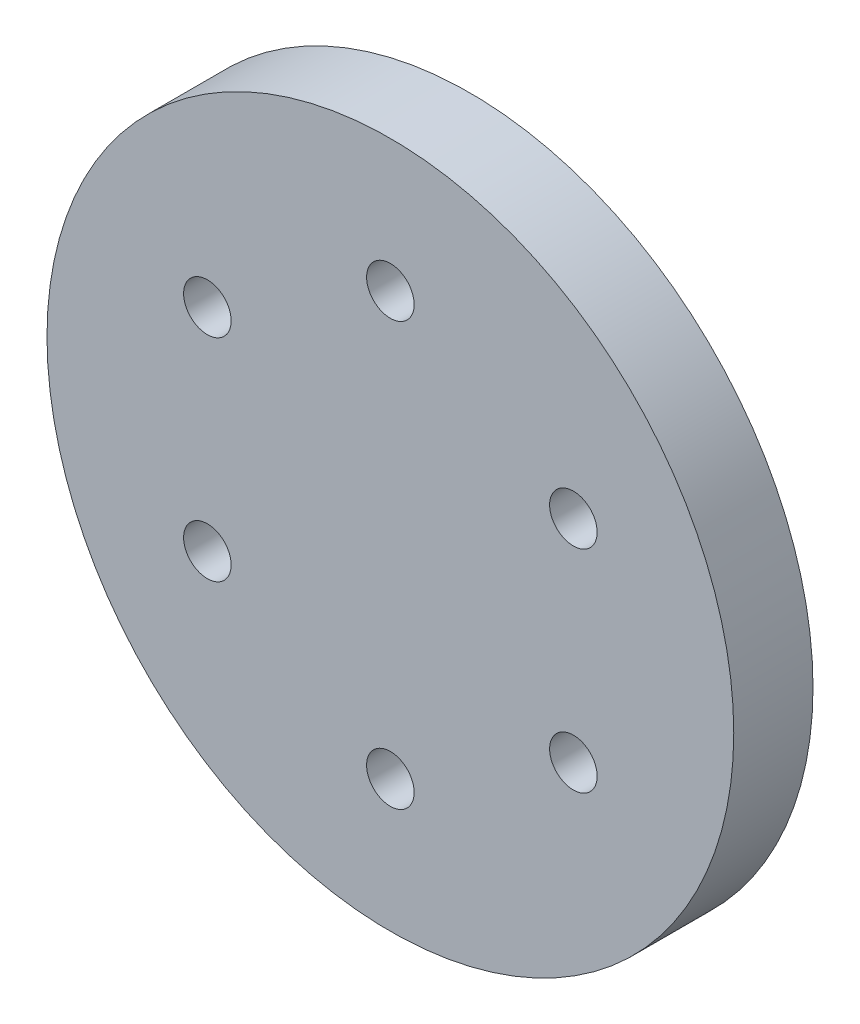
ISO-10303-21;
HEADER;
FILE_DESCRIPTION(('STEP AP214'),'2;1');
FILE_NAME('part.step','',(''),(''),'','','');
FILE_SCHEMA(('AUTOMOTIVE_DESIGN { 1 0 10303 214 1 1 1 1 }'));
ENDSEC;
DATA;
#1=APPLICATION_CONTEXT('core data for automotive mechanical design processes');
#2=APPLICATION_PROTOCOL_DEFINITION('international standard','automotive_design',2000,#1);
#3=PRODUCT_CONTEXT('',#1,'mechanical');
#4=PRODUCT('Part','Part','',(#3));
#5=PRODUCT_RELATED_PRODUCT_CATEGORY('part','',(#4));
#6=PRODUCT_DEFINITION_FORMATION('','',#4);
#7=PRODUCT_DEFINITION_CONTEXT('part definition',#1,'design');
#8=PRODUCT_DEFINITION('design','',#6,#7);
#9=PRODUCT_DEFINITION_SHAPE('','',#8);
#10=(LENGTH_UNIT() NAMED_UNIT(*) SI_UNIT(.MILLI.,.METRE.));
#11=(NAMED_UNIT(*) PLANE_ANGLE_UNIT() SI_UNIT($,.RADIAN.));
#12=(NAMED_UNIT(*) SI_UNIT($,.STERADIAN.) SOLID_ANGLE_UNIT());
#13=UNCERTAINTY_MEASURE_WITH_UNIT(LENGTH_MEASURE(1.E-05),#10,'distance_accuracy_value','');
#14=(GEOMETRIC_REPRESENTATION_CONTEXT(3) GLOBAL_UNCERTAINTY_ASSIGNED_CONTEXT((#13)) GLOBAL_UNIT_ASSIGNED_CONTEXT((#10,
#11,#12)) REPRESENTATION_CONTEXT('',''));
#15=CARTESIAN_POINT('',(0.,0.,0.));
#16=DIRECTION('',(0.,0.,1.));
#17=DIRECTION('',(1.,0.,0.));
#18=AXIS2_PLACEMENT_3D('',#15,#16,#17);
#19=CARTESIAN_POINT('',(-6.92820323027552,3.99999999999998,3.));
#20=DIRECTION('',(0.,0.,-1.));
#21=DIRECTION('',(-1.,0.,0.));
#22=AXIS2_PLACEMENT_3D('',#19,#20,#21);
#23=CYLINDRICAL_SURFACE('',#22,0.9);
#24=CARTESIAN_POINT('',(-6.92820323027552,3.99999999999998,3.));
#25=DIRECTION('',(0.,0.,-1.));
#26=DIRECTION('',(-0.499999999999998,-0.86602540378444,0.));
#27=AXIS2_PLACEMENT_3D('',#24,#25,#26);
#28=CIRCLE('',#27,0.9);
#29=CARTESIAN_POINT('',(-7.37820323027552,3.22057713659399,3.));
#30=VERTEX_POINT('',#29);
#31=EDGE_CURVE('E86',#30,#30,#28,.T.);
#32=ORIENTED_EDGE('',*,*,#31,.F.);
#33=EDGE_LOOP('',(#32));
#34=FACE_BOUND('',#33,.T.);
#35=CARTESIAN_POINT('',(-6.92820323027552,3.99999999999998,1.5));
#36=DIRECTION('',(0.,0.,-1.));
#37=DIRECTION('',(-1.,0.,0.));
#38=AXIS2_PLACEMENT_3D('',#35,#36,#37);
#39=CIRCLE('',#38,0.9);
#40=CARTESIAN_POINT('',(-7.82820323027552,3.99999999999998,1.5));
#41=VERTEX_POINT('',#40);
#42=EDGE_CURVE('E41',#41,#41,#39,.F.);
#43=ORIENTED_EDGE('',*,*,#42,.F.);
#44=EDGE_LOOP('',(#43));
#45=FACE_BOUND('',#44,.T.);
#46=ADVANCED_FACE('F37',(#34,#45),#23,.F.);
#47=CARTESIAN_POINT('',(-6.92820323027549,-4.00000000000003,3.));
#48=DIRECTION('',(0.,0.,-1.));
#49=DIRECTION('',(-1.,0.,0.));
#50=AXIS2_PLACEMENT_3D('',#47,#48,#49);
#51=CYLINDRICAL_SURFACE('',#50,0.9);
#52=CARTESIAN_POINT('',(-6.92820323027549,-4.00000000000003,3.));
#53=DIRECTION('',(0.,0.,-1.));
#54=DIRECTION('',(0.500000000000004,-0.866025403784436,0.));
#55=AXIS2_PLACEMENT_3D('',#52,#53,#54);
#56=CIRCLE('',#55,0.9);
#57=CARTESIAN_POINT('',(-6.47820323027549,-4.77942286340603,3.));
#58=VERTEX_POINT('',#57);
#59=EDGE_CURVE('E90',#58,#58,#56,.T.);
#60=ORIENTED_EDGE('',*,*,#59,.F.);
#61=EDGE_LOOP('',(#60));
#62=FACE_BOUND('',#61,.T.);
#63=CARTESIAN_POINT('',(-6.92820323027549,-4.00000000000003,1.5));
#64=DIRECTION('',(0.,0.,-1.));
#65=DIRECTION('',(-1.,0.,0.));
#66=AXIS2_PLACEMENT_3D('',#63,#64,#65);
#67=CIRCLE('',#66,0.9);
#68=CARTESIAN_POINT('',(-7.82820323027549,-4.00000000000003,1.5));
#69=VERTEX_POINT('',#68);
#70=EDGE_CURVE('E68',#69,#69,#67,.F.);
#71=ORIENTED_EDGE('',*,*,#70,.F.);
#72=EDGE_LOOP('',(#71));
#73=FACE_BOUND('',#72,.T.);
#74=ADVANCED_FACE('F117',(#62,#73),#51,.F.);
#75=CARTESIAN_POINT('',(0.,-8.,3.));
#76=DIRECTION('',(0.,0.,-1.));
#77=DIRECTION('',(-1.,0.,0.));
#78=AXIS2_PLACEMENT_3D('',#75,#76,#77);
#79=CYLINDRICAL_SURFACE('',#78,0.9);
#80=CARTESIAN_POINT('',(0.,-8.,3.));
#81=DIRECTION('',(0.,0.,-1.));
#82=DIRECTION('',(1.,0.,0.));
#83=AXIS2_PLACEMENT_3D('',#80,#81,#82);
#84=CIRCLE('',#83,0.9);
#85=CARTESIAN_POINT('',(0.9,-8.,3.));
#86=VERTEX_POINT('',#85);
#87=EDGE_CURVE('E82',#86,#86,#84,.T.);
#88=ORIENTED_EDGE('',*,*,#87,.F.);
#89=EDGE_LOOP('',(#88));
#90=FACE_BOUND('',#89,.T.);
#91=CARTESIAN_POINT('',(0.,-8.,1.5));
#92=DIRECTION('',(0.,0.,-1.));
#93=DIRECTION('',(-1.,0.,0.));
#94=AXIS2_PLACEMENT_3D('',#91,#92,#93);
#95=CIRCLE('',#94,0.9);
#96=CARTESIAN_POINT('',(-0.9,-8.,1.5));
#97=VERTEX_POINT('',#96);
#98=EDGE_CURVE('E66',#97,#97,#95,.F.);
#99=ORIENTED_EDGE('',*,*,#98,.F.);
#100=EDGE_LOOP('',(#99));
#101=FACE_BOUND('',#100,.T.);
#102=ADVANCED_FACE('F123',(#90,#101),#79,.F.);
#103=CARTESIAN_POINT('',(6.92820323027555,-3.99999999999994,3.));
#104=DIRECTION('',(0.,0.,-1.));
#105=DIRECTION('',(-1.,0.,0.));
#106=AXIS2_PLACEMENT_3D('',#103,#104,#105);
#107=CYLINDRICAL_SURFACE('',#106,0.9);
#108=CARTESIAN_POINT('',(6.92820323027555,-3.99999999999994,3.));
#109=DIRECTION('',(0.,0.,-1.));
#110=DIRECTION('',(0.499999999999992,0.866025403784443,0.));
#111=AXIS2_PLACEMENT_3D('',#108,#109,#110);
#112=CIRCLE('',#111,0.9);
#113=CARTESIAN_POINT('',(7.37820323027554,-3.22057713659394,3.));
#114=VERTEX_POINT('',#113);
#115=EDGE_CURVE('E77',#114,#114,#112,.T.);
#116=ORIENTED_EDGE('',*,*,#115,.F.);
#117=EDGE_LOOP('',(#116));
#118=FACE_BOUND('',#117,.T.);
#119=CARTESIAN_POINT('',(6.92820323027555,-3.99999999999994,1.5));
#120=DIRECTION('',(0.,0.,-1.));
#121=DIRECTION('',(-1.,0.,0.));
#122=AXIS2_PLACEMENT_3D('',#119,#120,#121);
#123=CIRCLE('',#122,0.9);
#124=CARTESIAN_POINT('',(6.02820323027555,-3.99999999999994,1.5));
#125=VERTEX_POINT('',#124);
#126=EDGE_CURVE('E62',#125,#125,#123,.F.);
#127=ORIENTED_EDGE('',*,*,#126,.F.);
#128=EDGE_LOOP('',(#127));
#129=FACE_BOUND('',#128,.T.);
#130=ADVANCED_FACE('F169',(#118,#129),#107,.F.);
#131=CARTESIAN_POINT('',(6.92820323027546,4.00000000000008,3.));
#132=DIRECTION('',(0.,0.,-1.));
#133=DIRECTION('',(-1.,0.,0.));
#134=AXIS2_PLACEMENT_3D('',#131,#132,#133);
#135=CYLINDRICAL_SURFACE('',#134,0.9);
#136=CARTESIAN_POINT('',(6.92820323027546,4.00000000000008,3.));
#137=DIRECTION('',(0.,0.,-1.));
#138=DIRECTION('',(-0.50000000000001,0.866025403784433,0.));
#139=AXIS2_PLACEMENT_3D('',#136,#137,#138);
#140=CIRCLE('',#139,0.9);
#141=CARTESIAN_POINT('',(6.47820323027545,4.77942286340607,3.));
#142=VERTEX_POINT('',#141);
#143=EDGE_CURVE('E73',#142,#142,#140,.T.);
#144=ORIENTED_EDGE('',*,*,#143,.F.);
#145=EDGE_LOOP('',(#144));
#146=FACE_BOUND('',#145,.T.);
#147=CARTESIAN_POINT('',(6.92820323027546,4.00000000000008,1.5));
#148=DIRECTION('',(0.,0.,-1.));
#149=DIRECTION('',(-1.,0.,0.));
#150=AXIS2_PLACEMENT_3D('',#147,#148,#149);
#151=CIRCLE('',#150,0.9);
#152=CARTESIAN_POINT('',(6.02820323027546,4.00000000000008,1.5));
#153=VERTEX_POINT('',#152);
#154=EDGE_CURVE('E59',#153,#153,#151,.F.);
#155=ORIENTED_EDGE('',*,*,#154,.F.);
#156=EDGE_LOOP('',(#155));
#157=FACE_BOUND('',#156,.T.);
#158=ADVANCED_FACE('F113',(#146,#157),#135,.F.);
#159=CARTESIAN_POINT('',(0.,8.,3.));
#160=DIRECTION('',(0.,0.,-1.));
#161=DIRECTION('',(-1.,0.,0.));
#162=AXIS2_PLACEMENT_3D('',#159,#160,#161);
#163=CYLINDRICAL_SURFACE('',#162,0.9);
#164=CARTESIAN_POINT('',(0.,8.,3.));
#165=DIRECTION('',(0.,0.,-1.));
#166=DIRECTION('',(-1.,0.,0.));
#167=AXIS2_PLACEMENT_3D('',#164,#165,#166);
#168=CIRCLE('',#167,0.9);
#169=CARTESIAN_POINT('',(-0.9,8.,3.));
#170=VERTEX_POINT('',#169);
#171=EDGE_CURVE('E50',#170,#170,#168,.T.);
#172=ORIENTED_EDGE('',*,*,#171,.F.);
#173=EDGE_LOOP('',(#172));
#174=FACE_BOUND('',#173,.T.);
#175=CARTESIAN_POINT('',(0.,8.,1.5));
#176=DIRECTION('',(0.,0.,-1.));
#177=DIRECTION('',(-1.,0.,0.));
#178=AXIS2_PLACEMENT_3D('',#175,#176,#177);
#179=CIRCLE('',#178,0.9);
#180=CARTESIAN_POINT('',(-0.9,8.,1.5));
#181=VERTEX_POINT('',#180);
#182=EDGE_CURVE('E55',#181,#181,#179,.F.);
#183=ORIENTED_EDGE('',*,*,#182,.F.);
#184=EDGE_LOOP('',(#183));
#185=FACE_BOUND('',#184,.T.);
#186=ADVANCED_FACE('F106',(#174,#185),#163,.F.);
#187=CARTESIAN_POINT('',(0.,0.,3.));
#188=DIRECTION('',(0.,0.,-1.));
#189=DIRECTION('',(-1.,0.,0.));
#190=AXIS2_PLACEMENT_3D('',#187,#188,#189);
#191=CYLINDRICAL_SURFACE('',#190,13.);
#192=CARTESIAN_POINT('',(0.,0.,3.));
#193=DIRECTION('',(0.,0.,1.));
#194=DIRECTION('',(1.,0.,0.));
#195=AXIS2_PLACEMENT_3D('',#192,#193,#194);
#196=CIRCLE('',#195,13.);
#197=CARTESIAN_POINT('',(13.,0.,3.));
#198=VERTEX_POINT('',#197);
#199=EDGE_CURVE('E10',#198,#198,#196,.T.);
#200=ORIENTED_EDGE('',*,*,#199,.F.);
#201=EDGE_LOOP('',(#200));
#202=FACE_BOUND('',#201,.T.);
#203=CARTESIAN_POINT('',(0.,0.,0.));
#204=DIRECTION('',(0.,0.,1.));
#205=DIRECTION('',(1.,0.,0.));
#206=AXIS2_PLACEMENT_3D('',#203,#204,#205);
#207=CIRCLE('',#206,13.);
#208=CARTESIAN_POINT('',(13.,0.,0.));
#209=VERTEX_POINT('',#208);
#210=EDGE_CURVE('E45',#209,#209,#207,.T.);
#211=ORIENTED_EDGE('',*,*,#210,.T.);
#212=EDGE_LOOP('',(#211));
#213=FACE_BOUND('',#212,.T.);
#214=ADVANCED_FACE('F39',(#202,#213),#191,.T.);
#215=CARTESIAN_POINT('',(0.,0.,3.));
#216=DIRECTION('',(0.,0.,1.));
#217=DIRECTION('',(1.,0.,0.));
#218=AXIS2_PLACEMENT_3D('',#215,#216,#217);
#219=PLANE('',#218);
#220=ORIENTED_EDGE('',*,*,#143,.T.);
#221=EDGE_LOOP('',(#220));
#222=FACE_BOUND('',#221,.T.);
#223=ORIENTED_EDGE('',*,*,#115,.T.);
#224=EDGE_LOOP('',(#223));
#225=FACE_BOUND('',#224,.T.);
#226=ORIENTED_EDGE('',*,*,#87,.T.);
#227=EDGE_LOOP('',(#226));
#228=FACE_BOUND('',#227,.T.);
#229=ORIENTED_EDGE('',*,*,#59,.T.);
#230=EDGE_LOOP('',(#229));
#231=FACE_BOUND('',#230,.T.);
#232=ORIENTED_EDGE('',*,*,#31,.T.);
#233=EDGE_LOOP('',(#232));
#234=FACE_BOUND('',#233,.T.);
#235=ORIENTED_EDGE('',*,*,#171,.T.);
#236=EDGE_LOOP('',(#235));
#237=FACE_BOUND('',#236,.T.);
#238=ORIENTED_EDGE('',*,*,#199,.T.);
#239=EDGE_LOOP('',(#238));
#240=FACE_BOUND('',#239,.T.);
#241=ADVANCED_FACE('F101',(#222,#225,#228,#231,#234,#237,#240),#219,.T.);
#242=CARTESIAN_POINT('',(0.,0.,0.));
#243=DIRECTION('',(0.,0.,1.));
#244=DIRECTION('',(1.,0.,0.));
#245=AXIS2_PLACEMENT_3D('',#242,#243,#244);
#246=PLANE('',#245);
#247=CARTESIAN_POINT('',(6.92820323027546,4.00000000000008,0.));
#248=DIRECTION('',(0.,0.,-1.));
#249=DIRECTION('',(-0.50000000000001,0.866025403784433,0.));
#250=AXIS2_PLACEMENT_3D('',#247,#248,#249);
#251=CIRCLE('',#250,1.5);
#252=CARTESIAN_POINT('',(6.17820323027545,5.29903810567673,0.));
#253=VERTEX_POINT('',#252);
#254=EDGE_CURVE('E229',#253,#253,#251,.T.);
#255=ORIENTED_EDGE('',*,*,#254,.F.);
#256=EDGE_LOOP('',(#255));
#257=FACE_BOUND('',#256,.T.);
#258=CARTESIAN_POINT('',(6.92820323027555,-3.99999999999994,0.));
#259=DIRECTION('',(0.,0.,-1.));
#260=DIRECTION('',(0.499999999999992,0.866025403784443,0.));
#261=AXIS2_PLACEMENT_3D('',#258,#259,#260);
#262=CIRCLE('',#261,1.5);
#263=CARTESIAN_POINT('',(7.67820323027553,-2.70096189432327,0.));
#264=VERTEX_POINT('',#263);
#265=EDGE_CURVE('E224',#264,#264,#262,.T.);
#266=ORIENTED_EDGE('',*,*,#265,.F.);
#267=EDGE_LOOP('',(#266));
#268=FACE_BOUND('',#267,.T.);
#269=CARTESIAN_POINT('',(0.,-8.,0.));
#270=DIRECTION('',(0.,0.,-1.));
#271=DIRECTION('',(1.,0.,0.));
#272=AXIS2_PLACEMENT_3D('',#269,#270,#271);
#273=CIRCLE('',#272,1.5);
#274=CARTESIAN_POINT('',(1.5,-8.,0.));
#275=VERTEX_POINT('',#274);
#276=EDGE_CURVE('E219',#275,#275,#273,.T.);
#277=ORIENTED_EDGE('',*,*,#276,.F.);
#278=EDGE_LOOP('',(#277));
#279=FACE_BOUND('',#278,.T.);
#280=CARTESIAN_POINT('',(-6.92820323027549,-4.00000000000003,0.));
#281=DIRECTION('',(0.,0.,-1.));
#282=DIRECTION('',(0.500000000000004,-0.866025403784436,0.));
#283=AXIS2_PLACEMENT_3D('',#280,#281,#282);
#284=CIRCLE('',#283,1.5);
#285=CARTESIAN_POINT('',(-6.17820323027549,-5.29903810567669,0.));
#286=VERTEX_POINT('',#285);
#287=EDGE_CURVE('E209',#286,#286,#284,.T.);
#288=ORIENTED_EDGE('',*,*,#287,.F.);
#289=EDGE_LOOP('',(#288));
#290=FACE_BOUND('',#289,.T.);
#291=CARTESIAN_POINT('',(-6.92820323027552,3.99999999999998,0.));
#292=DIRECTION('',(0.,0.,-1.));
#293=DIRECTION('',(-0.499999999999998,-0.86602540378444,0.));
#294=AXIS2_PLACEMENT_3D('',#291,#292,#293);
#295=CIRCLE('',#294,1.5);
#296=CARTESIAN_POINT('',(-7.67820323027552,2.70096189432332,0.));
#297=VERTEX_POINT('',#296);
#298=EDGE_CURVE('E208',#297,#297,#295,.T.);
#299=ORIENTED_EDGE('',*,*,#298,.F.);
#300=EDGE_LOOP('',(#299));
#301=FACE_BOUND('',#300,.T.);
#302=CARTESIAN_POINT('',(0.,8.,0.));
#303=DIRECTION('',(0.,0.,-1.));
#304=DIRECTION('',(-1.,0.,0.));
#305=AXIS2_PLACEMENT_3D('',#302,#303,#304);
#306=CIRCLE('',#305,1.5);
#307=CARTESIAN_POINT('',(-1.5,8.,0.));
#308=VERTEX_POINT('',#307);
#309=EDGE_CURVE('E89',#308,#308,#306,.T.);
#310=ORIENTED_EDGE('',*,*,#309,.F.);
#311=EDGE_LOOP('',(#310));
#312=FACE_BOUND('',#311,.T.);
#313=ORIENTED_EDGE('',*,*,#210,.F.);
#314=EDGE_LOOP('',(#313));
#315=FACE_BOUND('',#314,.T.);
#316=ADVANCED_FACE('F97',(#257,#268,#279,#290,#301,#312,#315),#246,.F.);
#317=CARTESIAN_POINT('',(0.,8.,1.5));
#318=DIRECTION('',(0.,0.,-1.));
#319=DIRECTION('',(-1.,0.,0.));
#320=AXIS2_PLACEMENT_3D('',#317,#318,#319);
#321=PLANE('',#320);
#322=CARTESIAN_POINT('',(0.,8.,1.5));
#323=DIRECTION('',(0.,0.,-1.));
#324=DIRECTION('',(-1.,0.,0.));
#325=AXIS2_PLACEMENT_3D('',#322,#323,#324);
#326=CIRCLE('',#325,1.5);
#327=CARTESIAN_POINT('',(-1.5,8.,1.5));
#328=VERTEX_POINT('',#327);
#329=EDGE_CURVE('E58',#328,#328,#326,.T.);
#330=ORIENTED_EDGE('',*,*,#329,.T.);
#331=EDGE_LOOP('',(#330));
#332=FACE_BOUND('',#331,.T.);
#333=ORIENTED_EDGE('',*,*,#182,.T.);
#334=EDGE_LOOP('',(#333));
#335=FACE_BOUND('',#334,.T.);
#336=ADVANCED_FACE('F100',(#332,#335),#321,.T.);
#337=CARTESIAN_POINT('',(0.,8.,1.5));
#338=DIRECTION('',(0.,0.,-1.));
#339=DIRECTION('',(-1.,0.,0.));
#340=AXIS2_PLACEMENT_3D('',#337,#338,#339);
#341=CYLINDRICAL_SURFACE('',#340,1.5);
#342=ORIENTED_EDGE('',*,*,#329,.F.);
#343=EDGE_LOOP('',(#342));
#344=FACE_BOUND('',#343,.T.);
#345=ORIENTED_EDGE('',*,*,#309,.T.);
#346=EDGE_LOOP('',(#345));
#347=FACE_BOUND('',#346,.T.);
#348=ADVANCED_FACE('F95',(#344,#347),#341,.F.);
#349=CARTESIAN_POINT('',(6.92820323027546,4.00000000000008,1.5));
#350=DIRECTION('',(0.,0.,-1.));
#351=DIRECTION('',(-0.50000000000001,0.866025403784433,0.));
#352=AXIS2_PLACEMENT_3D('',#349,#350,#351);
#353=PLANE('',#352);
#354=CARTESIAN_POINT('',(6.92820323027546,4.00000000000008,1.5));
#355=DIRECTION('',(0.,0.,-1.));
#356=DIRECTION('',(-0.50000000000001,0.866025403784433,0.));
#357=AXIS2_PLACEMENT_3D('',#354,#355,#356);
#358=CIRCLE('',#357,1.5);
#359=CARTESIAN_POINT('',(6.17820323027545,5.29903810567673,1.5));
#360=VERTEX_POINT('',#359);
#361=EDGE_CURVE('E227',#360,#360,#358,.T.);
#362=ORIENTED_EDGE('',*,*,#361,.T.);
#363=EDGE_LOOP('',(#362));
#364=FACE_BOUND('',#363,.T.);
#365=ORIENTED_EDGE('',*,*,#154,.T.);
#366=EDGE_LOOP('',(#365));
#367=FACE_BOUND('',#366,.T.);
#368=ADVANCED_FACE('F135',(#364,#367),#353,.T.);
#369=CARTESIAN_POINT('',(6.92820323027546,4.00000000000008,1.5));
#370=DIRECTION('',(0.,0.,-1.));
#371=DIRECTION('',(-1.,0.,0.));
#372=AXIS2_PLACEMENT_3D('',#369,#370,#371);
#373=CYLINDRICAL_SURFACE('',#372,1.5);
#374=ORIENTED_EDGE('',*,*,#361,.F.);
#375=EDGE_LOOP('',(#374));
#376=FACE_BOUND('',#375,.T.);
#377=ORIENTED_EDGE('',*,*,#254,.T.);
#378=EDGE_LOOP('',(#377));
#379=FACE_BOUND('',#378,.T.);
#380=ADVANCED_FACE('F140',(#376,#379),#373,.F.);
#381=CARTESIAN_POINT('',(6.92820323027555,-3.99999999999994,1.5));
#382=DIRECTION('',(0.,0.,-1.));
#383=DIRECTION('',(0.499999999999992,0.866025403784443,0.));
#384=AXIS2_PLACEMENT_3D('',#381,#382,#383);
#385=PLANE('',#384);
#386=CARTESIAN_POINT('',(6.92820323027555,-3.99999999999994,1.5));
#387=DIRECTION('',(0.,0.,-1.));
#388=DIRECTION('',(0.499999999999992,0.866025403784443,0.));
#389=AXIS2_PLACEMENT_3D('',#386,#387,#388);
#390=CIRCLE('',#389,1.5);
#391=CARTESIAN_POINT('',(7.67820323027553,-2.70096189432327,1.5));
#392=VERTEX_POINT('',#391);
#393=EDGE_CURVE('E222',#392,#392,#390,.T.);
#394=ORIENTED_EDGE('',*,*,#393,.T.);
#395=EDGE_LOOP('',(#394));
#396=FACE_BOUND('',#395,.T.);
#397=ORIENTED_EDGE('',*,*,#126,.T.);
#398=EDGE_LOOP('',(#397));
#399=FACE_BOUND('',#398,.T.);
#400=ADVANCED_FACE('F150',(#396,#399),#385,.T.);
#401=CARTESIAN_POINT('',(6.92820323027555,-3.99999999999994,1.5));
#402=DIRECTION('',(0.,0.,-1.));
#403=DIRECTION('',(-1.,0.,0.));
#404=AXIS2_PLACEMENT_3D('',#401,#402,#403);
#405=CYLINDRICAL_SURFACE('',#404,1.5);
#406=ORIENTED_EDGE('',*,*,#393,.F.);
#407=EDGE_LOOP('',(#406));
#408=FACE_BOUND('',#407,.T.);
#409=ORIENTED_EDGE('',*,*,#265,.T.);
#410=EDGE_LOOP('',(#409));
#411=FACE_BOUND('',#410,.T.);
#412=ADVANCED_FACE('F156',(#408,#411),#405,.F.);
#413=CARTESIAN_POINT('',(0.,-8.,1.5));
#414=DIRECTION('',(0.,0.,-1.));
#415=DIRECTION('',(1.,0.,0.));
#416=AXIS2_PLACEMENT_3D('',#413,#414,#415);
#417=PLANE('',#416);
#418=CARTESIAN_POINT('',(0.,-8.,1.5));
#419=DIRECTION('',(0.,0.,-1.));
#420=DIRECTION('',(1.,0.,0.));
#421=AXIS2_PLACEMENT_3D('',#418,#419,#420);
#422=CIRCLE('',#421,1.5);
#423=CARTESIAN_POINT('',(1.5,-8.,1.5));
#424=VERTEX_POINT('',#423);
#425=EDGE_CURVE('E214',#424,#424,#422,.T.);
#426=ORIENTED_EDGE('',*,*,#425,.T.);
#427=EDGE_LOOP('',(#426));
#428=FACE_BOUND('',#427,.T.);
#429=ORIENTED_EDGE('',*,*,#98,.T.);
#430=EDGE_LOOP('',(#429));
#431=FACE_BOUND('',#430,.T.);
#432=ADVANCED_FACE('F186',(#428,#431),#417,.T.);
#433=CARTESIAN_POINT('',(0.,-8.,1.5));
#434=DIRECTION('',(0.,0.,-1.));
#435=DIRECTION('',(-1.,0.,0.));
#436=AXIS2_PLACEMENT_3D('',#433,#434,#435);
#437=CYLINDRICAL_SURFACE('',#436,1.5);
#438=ORIENTED_EDGE('',*,*,#425,.F.);
#439=EDGE_LOOP('',(#438));
#440=FACE_BOUND('',#439,.T.);
#441=ORIENTED_EDGE('',*,*,#276,.T.);
#442=EDGE_LOOP('',(#441));
#443=FACE_BOUND('',#442,.T.);
#444=ADVANCED_FACE('F190',(#440,#443),#437,.F.);
#445=CARTESIAN_POINT('',(-6.92820323027549,-4.00000000000003,1.5));
#446=DIRECTION('',(0.,0.,-1.));
#447=DIRECTION('',(0.500000000000004,-0.866025403784436,0.));
#448=AXIS2_PLACEMENT_3D('',#445,#446,#447);
#449=PLANE('',#448);
#450=CARTESIAN_POINT('',(-6.92820323027549,-4.00000000000003,1.5));
#451=DIRECTION('',(0.,0.,-1.));
#452=DIRECTION('',(0.500000000000004,-0.866025403784436,0.));
#453=AXIS2_PLACEMENT_3D('',#450,#451,#452);
#454=CIRCLE('',#453,1.5);
#455=CARTESIAN_POINT('',(-6.17820323027549,-5.29903810567669,1.5));
#456=VERTEX_POINT('',#455);
#457=EDGE_CURVE('E207',#456,#456,#454,.T.);
#458=ORIENTED_EDGE('',*,*,#457,.T.);
#459=EDGE_LOOP('',(#458));
#460=FACE_BOUND('',#459,.T.);
#461=ORIENTED_EDGE('',*,*,#70,.T.);
#462=EDGE_LOOP('',(#461));
#463=FACE_BOUND('',#462,.T.);
#464=ADVANCED_FACE('F193',(#460,#463),#449,.T.);
#465=CARTESIAN_POINT('',(-6.92820323027549,-4.00000000000003,1.5));
#466=DIRECTION('',(0.,0.,-1.));
#467=DIRECTION('',(-1.,0.,0.));
#468=AXIS2_PLACEMENT_3D('',#465,#466,#467);
#469=CYLINDRICAL_SURFACE('',#468,1.5);
#470=ORIENTED_EDGE('',*,*,#457,.F.);
#471=EDGE_LOOP('',(#470));
#472=FACE_BOUND('',#471,.T.);
#473=ORIENTED_EDGE('',*,*,#287,.T.);
#474=EDGE_LOOP('',(#473));
#475=FACE_BOUND('',#474,.T.);
#476=ADVANCED_FACE('F163',(#472,#475),#469,.F.);
#477=CARTESIAN_POINT('',(-6.92820323027552,3.99999999999998,1.5));
#478=DIRECTION('',(0.,0.,-1.));
#479=DIRECTION('',(-0.499999999999998,-0.86602540378444,0.));
#480=AXIS2_PLACEMENT_3D('',#477,#478,#479);
#481=PLANE('',#480);
#482=CARTESIAN_POINT('',(-6.92820323027552,3.99999999999998,1.5));
#483=DIRECTION('',(0.,0.,-1.));
#484=DIRECTION('',(-0.499999999999998,-0.86602540378444,0.));
#485=AXIS2_PLACEMENT_3D('',#482,#483,#484);
#486=CIRCLE('',#485,1.5);
#487=CARTESIAN_POINT('',(-7.67820323027552,2.70096189432332,1.5));
#488=VERTEX_POINT('',#487);
#489=EDGE_CURVE('E63',#488,#488,#486,.T.);
#490=ORIENTED_EDGE('',*,*,#489,.T.);
#491=EDGE_LOOP('',(#490));
#492=FACE_BOUND('',#491,.T.);
#493=ORIENTED_EDGE('',*,*,#42,.T.);
#494=EDGE_LOOP('',(#493));
#495=FACE_BOUND('',#494,.T.);
#496=ADVANCED_FACE('F159',(#492,#495),#481,.T.);
#497=CARTESIAN_POINT('',(-6.92820323027552,3.99999999999998,1.5));
#498=DIRECTION('',(0.,0.,-1.));
#499=DIRECTION('',(-1.,0.,0.));
#500=AXIS2_PLACEMENT_3D('',#497,#498,#499);
#501=CYLINDRICAL_SURFACE('',#500,1.5);
#502=ORIENTED_EDGE('',*,*,#489,.F.);
#503=EDGE_LOOP('',(#502));
#504=FACE_BOUND('',#503,.T.);
#505=ORIENTED_EDGE('',*,*,#298,.T.);
#506=EDGE_LOOP('',(#505));
#507=FACE_BOUND('',#506,.T.);
#508=ADVANCED_FACE('F162',(#504,#507),#501,.F.);
#509=CLOSED_SHELL('',(#46,#74,#102,#130,#158,#186,#214,#241,#316,#336,#348,#368,#380,#400,#412,
#432,#444,#464,#476,#496,#508));
#510=MANIFOLD_SOLID_BREP('B2',#509);
#511=ADVANCED_BREP_SHAPE_REPRESENTATION('',(#18,#510),#14);
#512=SHAPE_DEFINITION_REPRESENTATION(#9,#511);
ENDSEC;
END-ISO-10303-21;
